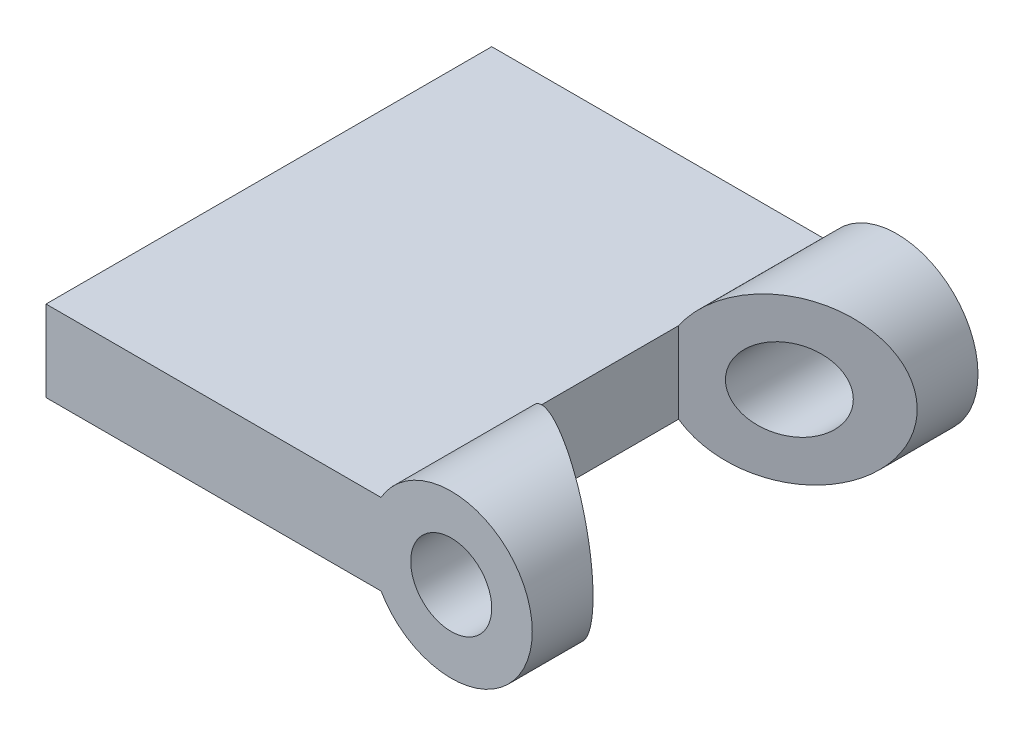
ISO-10303-21;
HEADER;
FILE_DESCRIPTION(('STEP AP214'),'2;1');
FILE_NAME('part.step','',(''),(''),'','','');
FILE_SCHEMA(('AUTOMOTIVE_DESIGN { 1 0 10303 214 1 1 1 1 }'));
ENDSEC;
DATA;
#1=APPLICATION_CONTEXT('core data for automotive mechanical design processes');
#2=APPLICATION_PROTOCOL_DEFINITION('international standard','automotive_design',2000,#1);
#3=PRODUCT_CONTEXT('',#1,'mechanical');
#4=PRODUCT('Part','Part','',(#3));
#5=PRODUCT_RELATED_PRODUCT_CATEGORY('part','',(#4));
#6=PRODUCT_DEFINITION_FORMATION('','',#4);
#7=PRODUCT_DEFINITION_CONTEXT('part definition',#1,'design');
#8=PRODUCT_DEFINITION('design','',#6,#7);
#9=PRODUCT_DEFINITION_SHAPE('','',#8);
#10=(LENGTH_UNIT() NAMED_UNIT(*) SI_UNIT(.MILLI.,.METRE.));
#11=(NAMED_UNIT(*) PLANE_ANGLE_UNIT() SI_UNIT($,.RADIAN.));
#12=(NAMED_UNIT(*) SI_UNIT($,.STERADIAN.) SOLID_ANGLE_UNIT());
#13=UNCERTAINTY_MEASURE_WITH_UNIT(LENGTH_MEASURE(1.E-05),#10,'distance_accuracy_value','');
#14=(GEOMETRIC_REPRESENTATION_CONTEXT(3) GLOBAL_UNCERTAINTY_ASSIGNED_CONTEXT((#13)) GLOBAL_UNIT_ASSIGNED_CONTEXT((#10,
#11,#12)) REPRESENTATION_CONTEXT('',''));
#15=CARTESIAN_POINT('',(0.,0.,0.));
#16=DIRECTION('',(0.,0.,1.));
#17=DIRECTION('',(1.,0.,0.));
#18=AXIS2_PLACEMENT_3D('',#15,#16,#17);
#19=CARTESIAN_POINT('',(0.,0.,55.));
#20=DIRECTION('',(0.,0.,-1.));
#21=DIRECTION('',(-1.,0.,0.));
#22=AXIS2_PLACEMENT_3D('',#19,#20,#21);
#23=CYLINDRICAL_SURFACE('',#22,20.);
#24=DIRECTION('',(0.,0.,-1.));
#25=VECTOR('',#24,1.);
#26=CARTESIAN_POINT('',(-17.3205080756888,-10.,55.));
#27=LINE('',#26,#25);
#28=CARTESIAN_POINT('',(-17.3205080756888,-10.,55.));
#29=VERTEX_POINT('',#28);
#30=CARTESIAN_POINT('',(-17.3205080756888,-10.,18.4529946162076));
#31=VERTEX_POINT('',#30);
#32=EDGE_CURVE('E109',#29,#31,#27,.T.);
#33=ORIENTED_EDGE('',*,*,#32,.T.);
#34=CARTESIAN_POINT('',(0.,0.,28.4529946162076));
#35=DIRECTION('',(-0.499999999999998,0.,0.86602540378444));
#36=DIRECTION('',(-0.86602540378444,0.,-0.499999999999998));
#37=AXIS2_PLACEMENT_3D('',#34,#35,#36);
#38=ELLIPSE('',#37,23.094010767585,20.);
#39=CARTESIAN_POINT('',(-17.3205080756888,10.,18.4529946162076));
#40=VERTEX_POINT('',#39);
#41=EDGE_CURVE('E135',#31,#40,#38,.T.);
#42=ORIENTED_EDGE('',*,*,#41,.T.);
#43=DIRECTION('',(0.,0.,-1.));
#44=VECTOR('',#43,1.);
#45=CARTESIAN_POINT('',(-17.3205080756888,10.,55.));
#46=LINE('',#45,#44);
#47=CARTESIAN_POINT('',(-17.3205080756888,10.,55.));
#48=VERTEX_POINT('',#47);
#49=EDGE_CURVE('E124',#48,#40,#46,.T.);
#50=ORIENTED_EDGE('',*,*,#49,.F.);
#51=CARTESIAN_POINT('',(0.,0.,55.));
#52=DIRECTION('',(0.,0.,1.));
#53=DIRECTION('',(1.,0.,0.));
#54=AXIS2_PLACEMENT_3D('',#51,#52,#53);
#55=CIRCLE('',#54,20.);
#56=EDGE_CURVE('E11',#29,#48,#55,.T.);
#57=ORIENTED_EDGE('',*,*,#56,.F.);
#58=EDGE_LOOP('',(#33,#42,#50,#57));
#59=FACE_BOUND('',#58,.T.);
#60=ADVANCED_FACE('F39',(#59),#23,.T.);
#61=CARTESIAN_POINT('',(0.,0.,-55.));
#62=DIRECTION('',(0.,0.,1.));
#63=DIRECTION('',(1.,0.,0.));
#64=AXIS2_PLACEMENT_3D('',#61,#62,#63);
#65=CYLINDRICAL_SURFACE('',#64,10.);
#66=CARTESIAN_POINT('',(0.,0.,28.4529946162075));
#67=DIRECTION('',(-0.499999999999998,0.,0.86602540378444));
#68=DIRECTION('',(0.86602540378444,0.,0.499999999999998));
#69=AXIS2_PLACEMENT_3D('',#66,#67,#68);
#70=ELLIPSE('',#69,11.5470053837925,10.);
#71=CARTESIAN_POINT('',(10.,0.,34.2264973081038));
#72=VERTEX_POINT('',#71);
#73=EDGE_CURVE('E43',#72,#72,#70,.F.);
#74=ORIENTED_EDGE('',*,*,#73,.T.);
#75=EDGE_LOOP('',(#74));
#76=FACE_BOUND('',#75,.T.);
#77=CARTESIAN_POINT('',(0.,0.,55.));
#78=DIRECTION('',(0.,0.,1.));
#79=DIRECTION('',(1.,0.,0.));
#80=AXIS2_PLACEMENT_3D('',#77,#78,#79);
#81=CIRCLE('',#80,10.);
#82=CARTESIAN_POINT('',(10.,0.,55.));
#83=VERTEX_POINT('',#82);
#84=EDGE_CURVE('E139',#83,#83,#81,.T.);
#85=ORIENTED_EDGE('',*,*,#84,.T.);
#86=EDGE_LOOP('',(#85));
#87=FACE_BOUND('',#86,.T.);
#88=ADVANCED_FACE('F185',(#76,#87),#65,.F.);
#89=CARTESIAN_POINT('',(0.,0.,-28.4529946162076));
#90=DIRECTION('',(-0.499999999999998,0.,-0.86602540378444));
#91=DIRECTION('',(0.86602540378444,0.,-0.499999999999998));
#92=AXIS2_PLACEMENT_3D('',#89,#90,#91);
#93=ELLIPSE('',#92,23.094010767585,20.);
#94=CARTESIAN_POINT('',(-17.3205080756888,10.,-18.4529946162076));
#95=VERTEX_POINT('',#94);
#96=CARTESIAN_POINT('',(-17.3205080756888,-10.,-18.4529946162076));
#97=VERTEX_POINT('',#96);
#98=EDGE_CURVE('E95',#95,#97,#93,.T.);
#99=ORIENTED_EDGE('',*,*,#98,.T.);
#100=CARTESIAN_POINT('',(-17.3205080756888,-10.,-55.));
#101=VERTEX_POINT('',#100);
#102=EDGE_CURVE('E64',#97,#101,#27,.T.);
#103=ORIENTED_EDGE('',*,*,#102,.T.);
#104=CARTESIAN_POINT('',(0.,0.,-55.));
#105=DIRECTION('',(0.,0.,1.));
#106=DIRECTION('',(1.,0.,0.));
#107=AXIS2_PLACEMENT_3D('',#104,#105,#106);
#108=CIRCLE('',#107,20.);
#109=CARTESIAN_POINT('',(-17.3205080756888,10.,-55.));
#110=VERTEX_POINT('',#109);
#111=EDGE_CURVE('E48',#101,#110,#108,.T.);
#112=ORIENTED_EDGE('',*,*,#111,.T.);
#113=EDGE_CURVE('E96',#95,#110,#46,.T.);
#114=ORIENTED_EDGE('',*,*,#113,.F.);
#115=EDGE_LOOP('',(#99,#103,#112,#114));
#116=FACE_BOUND('',#115,.T.);
#117=ADVANCED_FACE('F41',(#116),#23,.T.);
#118=CARTESIAN_POINT('',(0.,0.,55.));
#119=DIRECTION('',(0.,0.,1.));
#120=DIRECTION('',(1.,0.,0.));
#121=AXIS2_PLACEMENT_3D('',#118,#119,#120);
#122=PLANE('',#121);
#123=ORIENTED_EDGE('',*,*,#84,.F.);
#124=EDGE_LOOP('',(#123));
#125=FACE_BOUND('',#124,.T.);
#126=ORIENTED_EDGE('',*,*,#56,.T.);
#127=DIRECTION('',(1.,0.,0.));
#128=VECTOR('',#127,1.);
#129=CARTESIAN_POINT('',(0.,10.,55.));
#130=LINE('',#129,#128);
#131=CARTESIAN_POINT('',(-100.,10.,55.));
#132=VERTEX_POINT('',#131);
#133=EDGE_CURVE('E150',#132,#48,#130,.T.);
#134=ORIENTED_EDGE('',*,*,#133,.F.);
#135=DIRECTION('',(0.,-1.,0.));
#136=VECTOR('',#135,1.);
#137=CARTESIAN_POINT('',(-100.,10.,55.));
#138=LINE('',#137,#136);
#139=CARTESIAN_POINT('',(-100.,-10.,55.));
#140=VERTEX_POINT('',#139);
#141=EDGE_CURVE('E119',#132,#140,#138,.T.);
#142=ORIENTED_EDGE('',*,*,#141,.T.);
#143=DIRECTION('',(1.,0.,0.));
#144=VECTOR('',#143,1.);
#145=CARTESIAN_POINT('',(0.,-10.,55.));
#146=LINE('',#145,#144);
#147=EDGE_CURVE('E148',#140,#29,#146,.T.);
#148=ORIENTED_EDGE('',*,*,#147,.T.);
#149=EDGE_LOOP('',(#126,#134,#142,#148));
#150=FACE_BOUND('',#149,.T.);
#151=ADVANCED_FACE('F162',(#125,#150),#122,.T.);
#152=CARTESIAN_POINT('',(0.,0.,-55.));
#153=DIRECTION('',(0.,0.,1.));
#154=DIRECTION('',(1.,0.,0.));
#155=AXIS2_PLACEMENT_3D('',#152,#153,#154);
#156=PLANE('',#155);
#157=CARTESIAN_POINT('',(0.,0.,-55.));
#158=DIRECTION('',(0.,0.,1.));
#159=DIRECTION('',(1.,0.,0.));
#160=AXIS2_PLACEMENT_3D('',#157,#158,#159);
#161=CIRCLE('',#160,10.);
#162=CARTESIAN_POINT('',(10.,0.,-55.));
#163=VERTEX_POINT('',#162);
#164=EDGE_CURVE('E140',#163,#163,#161,.T.);
#165=ORIENTED_EDGE('',*,*,#164,.T.);
#166=EDGE_LOOP('',(#165));
#167=FACE_BOUND('',#166,.T.);
#168=ORIENTED_EDGE('',*,*,#111,.F.);
#169=DIRECTION('',(-1.,0.,0.));
#170=VECTOR('',#169,1.);
#171=CARTESIAN_POINT('',(0.,-10.,-55.));
#172=LINE('',#171,#170);
#173=CARTESIAN_POINT('',(-100.,-10.,-55.));
#174=VERTEX_POINT('',#173);
#175=EDGE_CURVE('E115',#101,#174,#172,.T.);
#176=ORIENTED_EDGE('',*,*,#175,.T.);
#177=DIRECTION('',(0.,-1.,0.));
#178=VECTOR('',#177,1.);
#179=CARTESIAN_POINT('',(-100.,10.,-55.));
#180=LINE('',#179,#178);
#181=CARTESIAN_POINT('',(-100.,10.,-55.));
#182=VERTEX_POINT('',#181);
#183=EDGE_CURVE('E117',#182,#174,#180,.T.);
#184=ORIENTED_EDGE('',*,*,#183,.F.);
#185=DIRECTION('',(-1.,0.,0.));
#186=VECTOR('',#185,1.);
#187=CARTESIAN_POINT('',(0.,10.,-55.));
#188=LINE('',#187,#186);
#189=EDGE_CURVE('E145',#110,#182,#188,.T.);
#190=ORIENTED_EDGE('',*,*,#189,.F.);
#191=EDGE_LOOP('',(#168,#176,#184,#190));
#192=FACE_BOUND('',#191,.T.);
#193=ADVANCED_FACE('F168',(#167,#192),#156,.F.);
#194=CARTESIAN_POINT('',(0.,10.,0.));
#195=DIRECTION('',(0.,-1.,0.));
#196=DIRECTION('',(0.,0.,-1.));
#197=AXIS2_PLACEMENT_3D('',#194,#195,#196);
#198=PLANE('',#197);
#199=ORIENTED_EDGE('',*,*,#133,.T.);
#200=ORIENTED_EDGE('',*,*,#49,.T.);
#201=DIRECTION('',(0.,0.,-1.));
#202=VECTOR('',#201,1.);
#203=CARTESIAN_POINT('',(-17.3205080756888,10.,0.));
#204=LINE('',#203,#202);
#205=EDGE_CURVE('E137',#40,#95,#204,.T.);
#206=ORIENTED_EDGE('',*,*,#205,.T.);
#207=ORIENTED_EDGE('',*,*,#113,.T.);
#208=ORIENTED_EDGE('',*,*,#189,.T.);
#209=DIRECTION('',(0.,0.,1.));
#210=VECTOR('',#209,1.);
#211=CARTESIAN_POINT('',(-100.,10.,-55.));
#212=LINE('',#211,#210);
#213=EDGE_CURVE('E147',#182,#132,#212,.T.);
#214=ORIENTED_EDGE('',*,*,#213,.T.);
#215=EDGE_LOOP('',(#199,#200,#206,#207,#208,#214));
#216=FACE_BOUND('',#215,.T.);
#217=ADVANCED_FACE('F169',(#216),#198,.F.);
#218=CARTESIAN_POINT('',(0.,-10.,0.));
#219=DIRECTION('',(0.,-1.,0.));
#220=DIRECTION('',(0.,0.,-1.));
#221=AXIS2_PLACEMENT_3D('',#218,#219,#220);
#222=PLANE('',#221);
#223=ORIENTED_EDGE('',*,*,#32,.F.);
#224=ORIENTED_EDGE('',*,*,#147,.F.);
#225=DIRECTION('',(0.,0.,1.));
#226=VECTOR('',#225,1.);
#227=CARTESIAN_POINT('',(-100.,-10.,-55.));
#228=LINE('',#227,#226);
#229=EDGE_CURVE('E153',#174,#140,#228,.T.);
#230=ORIENTED_EDGE('',*,*,#229,.F.);
#231=ORIENTED_EDGE('',*,*,#175,.F.);
#232=ORIENTED_EDGE('',*,*,#102,.F.);
#233=EDGE_CURVE('E104',#31,#97,#27,.T.);
#234=ORIENTED_EDGE('',*,*,#233,.F.);
#235=EDGE_LOOP('',(#223,#224,#230,#231,#232,#234));
#236=FACE_BOUND('',#235,.T.);
#237=ADVANCED_FACE('F113',(#236),#222,.T.);
#238=CARTESIAN_POINT('',(-100.,10.,-55.));
#239=DIRECTION('',(1.,0.,0.));
#240=DIRECTION('',(0.,0.,-1.));
#241=AXIS2_PLACEMENT_3D('',#238,#239,#240);
#242=PLANE('',#241);
#243=ORIENTED_EDGE('',*,*,#229,.T.);
#244=ORIENTED_EDGE('',*,*,#141,.F.);
#245=ORIENTED_EDGE('',*,*,#213,.F.);
#246=ORIENTED_EDGE('',*,*,#183,.T.);
#247=EDGE_LOOP('',(#243,#244,#245,#246));
#248=FACE_BOUND('',#247,.T.);
#249=ADVANCED_FACE('F165',(#248),#242,.F.);
#250=CARTESIAN_POINT('',(0.,0.,-28.4529946162075));
#251=DIRECTION('',(-0.499999999999998,0.,-0.86602540378444));
#252=DIRECTION('',(-0.86602540378444,0.,0.499999999999998));
#253=AXIS2_PLACEMENT_3D('',#250,#251,#252);
#254=ELLIPSE('',#253,11.5470053837925,10.);
#255=CARTESIAN_POINT('',(-10.,0.,-22.6794919243113));
#256=VERTEX_POINT('',#255);
#257=EDGE_CURVE('E101',#256,#256,#254,.F.);
#258=ORIENTED_EDGE('',*,*,#257,.T.);
#259=EDGE_LOOP('',(#258));
#260=FACE_BOUND('',#259,.T.);
#261=ORIENTED_EDGE('',*,*,#164,.F.);
#262=EDGE_LOOP('',(#261));
#263=FACE_BOUND('',#262,.T.);
#264=ADVANCED_FACE('F181',(#260,#263),#65,.F.);
#265=CARTESIAN_POINT('',(-17.3205080756888,-20.,18.4529946162076));
#266=DIRECTION('',(-1.,0.,0.));
#267=DIRECTION('',(0.,0.,1.));
#268=AXIS2_PLACEMENT_3D('',#265,#266,#267);
#269=PLANE('',#268);
#270=DIRECTION('',(0.,1.,0.));
#271=VECTOR('',#270,1.);
#272=CARTESIAN_POINT('',(-17.3205080756888,-20.,18.4529946162076));
#273=LINE('',#272,#271);
#274=EDGE_CURVE('E56',#31,#40,#273,.T.);
#275=ORIENTED_EDGE('',*,*,#274,.F.);
#276=ORIENTED_EDGE('',*,*,#233,.T.);
#277=DIRECTION('',(0.,1.,0.));
#278=VECTOR('',#277,1.);
#279=CARTESIAN_POINT('',(-17.3205080756888,-20.,-18.4529946162076));
#280=LINE('',#279,#278);
#281=EDGE_CURVE('E106',#97,#95,#280,.T.);
#282=ORIENTED_EDGE('',*,*,#281,.T.);
#283=ORIENTED_EDGE('',*,*,#205,.F.);
#284=EDGE_LOOP('',(#275,#276,#282,#283));
#285=FACE_BOUND('',#284,.T.);
#286=ADVANCED_FACE('F105',(#285),#269,.F.);
#287=CARTESIAN_POINT('',(20.,-20.,40.));
#288=DIRECTION('',(-0.499999999999998,0.,0.86602540378444));
#289=DIRECTION('',(0.86602540378444,0.,0.499999999999998));
#290=AXIS2_PLACEMENT_3D('',#287,#288,#289);
#291=PLANE('',#290);
#292=ORIENTED_EDGE('',*,*,#73,.F.);
#293=EDGE_LOOP('',(#292));
#294=FACE_BOUND('',#293,.T.);
#295=ORIENTED_EDGE('',*,*,#274,.T.);
#296=ORIENTED_EDGE('',*,*,#41,.F.);
#297=EDGE_LOOP('',(#295,#296));
#298=FACE_BOUND('',#297,.T.);
#299=ADVANCED_FACE('F171',(#294,#298),#291,.F.);
#300=CARTESIAN_POINT('',(20.,-20.,-40.));
#301=DIRECTION('',(-0.499999999999998,0.,-0.86602540378444));
#302=DIRECTION('',(-0.86602540378444,0.,0.499999999999998));
#303=AXIS2_PLACEMENT_3D('',#300,#301,#302);
#304=PLANE('',#303);
#305=ORIENTED_EDGE('',*,*,#257,.F.);
#306=EDGE_LOOP('',(#305));
#307=FACE_BOUND('',#306,.T.);
#308=ORIENTED_EDGE('',*,*,#98,.F.);
#309=ORIENTED_EDGE('',*,*,#281,.F.);
#310=EDGE_LOOP('',(#308,#309));
#311=FACE_BOUND('',#310,.T.);
#312=ADVANCED_FACE('F111',(#307,#311),#304,.F.);
#313=CLOSED_SHELL('',(#60,#88,#117,#151,#193,#217,#237,#249,#264,#286,#299,#312));
#314=MANIFOLD_SOLID_BREP('B2',#313);
#315=ADVANCED_BREP_SHAPE_REPRESENTATION('',(#18,#314),#14);
#316=SHAPE_DEFINITION_REPRESENTATION(#9,#315);
ENDSEC;
END-ISO-10303-21;
